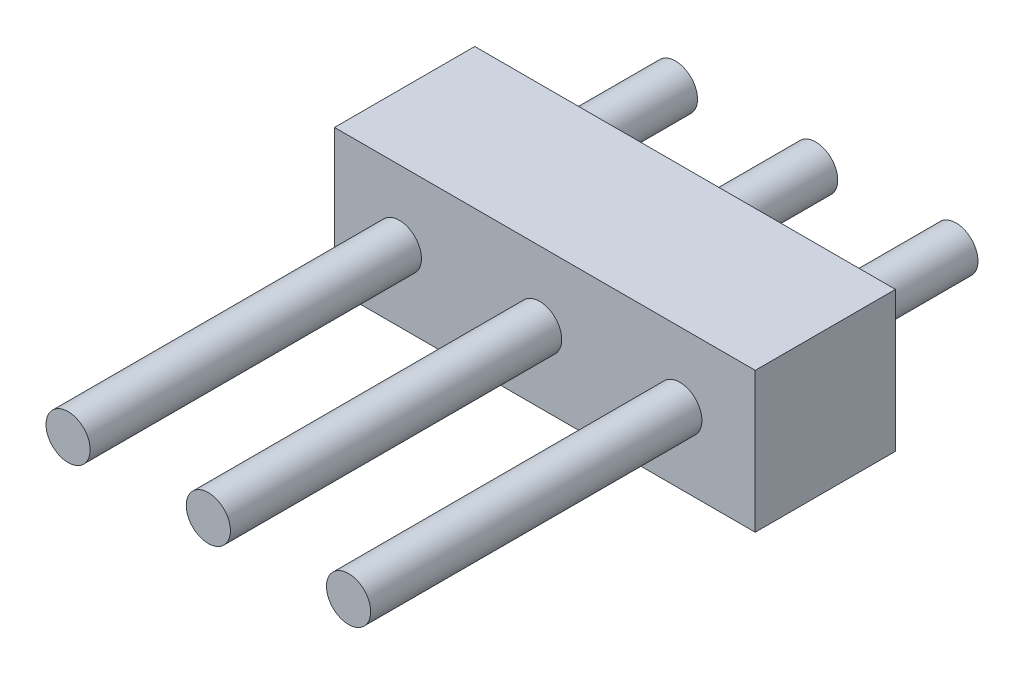
ISO-10303-21;
HEADER;
FILE_DESCRIPTION(('STEP AP214'),'2;1');
FILE_NAME('part.step','',(''),(''),'','','');
FILE_SCHEMA(('AUTOMOTIVE_DESIGN { 1 0 10303 214 1 1 1 1 }'));
ENDSEC;
DATA;
#1=APPLICATION_CONTEXT('core data for automotive mechanical design processes');
#2=APPLICATION_PROTOCOL_DEFINITION('international standard','automotive_design',2000,#1);
#3=PRODUCT_CONTEXT('',#1,'mechanical');
#4=PRODUCT('Part','Part','',(#3));
#5=PRODUCT_RELATED_PRODUCT_CATEGORY('part','',(#4));
#6=PRODUCT_DEFINITION_FORMATION('','',#4);
#7=PRODUCT_DEFINITION_CONTEXT('part definition',#1,'design');
#8=PRODUCT_DEFINITION('design','',#6,#7);
#9=PRODUCT_DEFINITION_SHAPE('','',#8);
#10=(LENGTH_UNIT() NAMED_UNIT(*) SI_UNIT(.MILLI.,.METRE.));
#11=(NAMED_UNIT(*) PLANE_ANGLE_UNIT() SI_UNIT($,.RADIAN.));
#12=(NAMED_UNIT(*) SI_UNIT($,.STERADIAN.) SOLID_ANGLE_UNIT());
#13=UNCERTAINTY_MEASURE_WITH_UNIT(LENGTH_MEASURE(1.E-05),#10,'distance_accuracy_value','');
#14=(GEOMETRIC_REPRESENTATION_CONTEXT(3) GLOBAL_UNCERTAINTY_ASSIGNED_CONTEXT((#13)) GLOBAL_UNIT_ASSIGNED_CONTEXT((#10,
#11,#12)) REPRESENTATION_CONTEXT('',''));
#15=CARTESIAN_POINT('',(0.,0.,0.));
#16=DIRECTION('',(0.,0.,1.));
#17=DIRECTION('',(1.,0.,0.));
#18=AXIS2_PLACEMENT_3D('',#15,#16,#17);
#19=CARTESIAN_POINT('',(0.,2.54,2.54));
#20=DIRECTION('',(0.,0.,-1.));
#21=DIRECTION('',(-1.,0.,0.));
#22=AXIS2_PLACEMENT_3D('',#19,#20,#21);
#23=PLANE('',#22);
#24=CARTESIAN_POINT('',(3.71440860215054,1.27,2.54));
#25=DIRECTION('',(0.,0.,-1.));
#26=DIRECTION('',(-1.,0.,0.));
#27=AXIS2_PLACEMENT_3D('',#24,#25,#26);
#28=CIRCLE('',#27,0.4);
#29=CARTESIAN_POINT('',(3.31440860215054,1.27,2.54));
#30=VERTEX_POINT('',#29);
#31=EDGE_CURVE('E38',#30,#30,#28,.F.);
#32=ORIENTED_EDGE('',*,*,#31,.F.);
#33=EDGE_LOOP('',(#32));
#34=FACE_BOUND('',#33,.T.);
#35=DIRECTION('',(0.,-1.,0.));
#36=VECTOR('',#35,1.);
#37=CARTESIAN_POINT('',(0.,0.,2.54));
#38=LINE('',#37,#36);
#39=CARTESIAN_POINT('',(0.,2.54,2.54));
#40=VERTEX_POINT('',#39);
#41=CARTESIAN_POINT('',(0.,0.,2.54));
#42=VERTEX_POINT('',#41);
#43=EDGE_CURVE('E106',#40,#42,#38,.T.);
#44=ORIENTED_EDGE('',*,*,#43,.T.);
#45=DIRECTION('',(1.,0.,0.));
#46=VECTOR('',#45,1.);
#47=CARTESIAN_POINT('',(0.,0.,2.54));
#48=LINE('',#47,#46);
#49=CARTESIAN_POINT('',(7.62,0.,2.54));
#50=VERTEX_POINT('',#49);
#51=EDGE_CURVE('E87',#42,#50,#48,.T.);
#52=ORIENTED_EDGE('',*,*,#51,.T.);
#53=DIRECTION('',(0.,1.,0.));
#54=VECTOR('',#53,1.);
#55=CARTESIAN_POINT('',(7.62,0.,2.54));
#56=LINE('',#55,#54);
#57=CARTESIAN_POINT('',(7.62,2.54,2.54));
#58=VERTEX_POINT('',#57);
#59=EDGE_CURVE('E51',#50,#58,#56,.T.);
#60=ORIENTED_EDGE('',*,*,#59,.T.);
#61=DIRECTION('',(-1.,0.,0.));
#62=VECTOR('',#61,1.);
#63=CARTESIAN_POINT('',(0.,2.54,2.54));
#64=LINE('',#63,#62);
#65=EDGE_CURVE('E46',#58,#40,#64,.T.);
#66=ORIENTED_EDGE('',*,*,#65,.T.);
#67=EDGE_LOOP('',(#44,#52,#60,#66));
#68=FACE_BOUND('',#67,.T.);
#69=CARTESIAN_POINT('',(1.17440860215054,1.27,2.54));
#70=DIRECTION('',(0.,0.,-1.));
#71=DIRECTION('',(-1.,0.,0.));
#72=AXIS2_PLACEMENT_3D('',#69,#70,#71);
#73=CIRCLE('',#72,0.4);
#74=CARTESIAN_POINT('',(0.774408602150538,1.27,2.54));
#75=VERTEX_POINT('',#74);
#76=EDGE_CURVE('E90',#75,#75,#73,.F.);
#77=ORIENTED_EDGE('',*,*,#76,.F.);
#78=EDGE_LOOP('',(#77));
#79=FACE_BOUND('',#78,.T.);
#80=CARTESIAN_POINT('',(6.25440860215054,1.27,2.54));
#81=DIRECTION('',(0.,0.,-1.));
#82=DIRECTION('',(-1.,0.,0.));
#83=AXIS2_PLACEMENT_3D('',#80,#81,#82);
#84=CIRCLE('',#83,0.4);
#85=CARTESIAN_POINT('',(5.85440860215054,1.27,2.54));
#86=VERTEX_POINT('',#85);
#87=EDGE_CURVE('E11',#86,#86,#84,.F.);
#88=ORIENTED_EDGE('',*,*,#87,.F.);
#89=EDGE_LOOP('',(#88));
#90=FACE_BOUND('',#89,.T.);
#91=ADVANCED_FACE('F29',(#34,#68,#79,#90),#23,.F.);
#92=CARTESIAN_POINT('',(0.,2.54,0.));
#93=DIRECTION('',(0.,0.,-1.));
#94=DIRECTION('',(-1.,0.,0.));
#95=AXIS2_PLACEMENT_3D('',#92,#93,#94);
#96=PLANE('',#95);
#97=CARTESIAN_POINT('',(3.71440860215054,1.27,0.));
#98=DIRECTION('',(0.,0.,-1.));
#99=DIRECTION('',(-1.,0.,0.));
#100=AXIS2_PLACEMENT_3D('',#97,#98,#99);
#101=CIRCLE('',#100,0.4);
#102=CARTESIAN_POINT('',(3.31440860215054,1.27,0.));
#103=VERTEX_POINT('',#102);
#104=EDGE_CURVE('E115',#103,#103,#101,.F.);
#105=ORIENTED_EDGE('',*,*,#104,.T.);
#106=EDGE_LOOP('',(#105));
#107=FACE_BOUND('',#106,.T.);
#108=DIRECTION('',(0.,-1.,0.));
#109=VECTOR('',#108,1.);
#110=CARTESIAN_POINT('',(0.,0.,0.));
#111=LINE('',#110,#109);
#112=CARTESIAN_POINT('',(0.,2.54,0.));
#113=VERTEX_POINT('',#112);
#114=CARTESIAN_POINT('',(0.,0.,0.));
#115=VERTEX_POINT('',#114);
#116=EDGE_CURVE('E78',#113,#115,#111,.T.);
#117=ORIENTED_EDGE('',*,*,#116,.F.);
#118=DIRECTION('',(-1.,0.,0.));
#119=VECTOR('',#118,1.);
#120=CARTESIAN_POINT('',(0.,2.54,0.));
#121=LINE('',#120,#119);
#122=CARTESIAN_POINT('',(7.62,2.54,0.));
#123=VERTEX_POINT('',#122);
#124=EDGE_CURVE('E104',#123,#113,#121,.T.);
#125=ORIENTED_EDGE('',*,*,#124,.F.);
#126=DIRECTION('',(0.,1.,0.));
#127=VECTOR('',#126,1.);
#128=CARTESIAN_POINT('',(7.62,0.,0.));
#129=LINE('',#128,#127);
#130=CARTESIAN_POINT('',(7.62,0.,0.));
#131=VERTEX_POINT('',#130);
#132=EDGE_CURVE('E79',#131,#123,#129,.T.);
#133=ORIENTED_EDGE('',*,*,#132,.F.);
#134=DIRECTION('',(1.,0.,0.));
#135=VECTOR('',#134,1.);
#136=CARTESIAN_POINT('',(0.,0.,0.));
#137=LINE('',#136,#135);
#138=EDGE_CURVE('E72',#115,#131,#137,.T.);
#139=ORIENTED_EDGE('',*,*,#138,.F.);
#140=EDGE_LOOP('',(#117,#125,#133,#139));
#141=FACE_BOUND('',#140,.T.);
#142=CARTESIAN_POINT('',(1.17440860215054,1.27,0.));
#143=DIRECTION('',(0.,0.,-1.));
#144=DIRECTION('',(-1.,0.,0.));
#145=AXIS2_PLACEMENT_3D('',#142,#143,#144);
#146=CIRCLE('',#145,0.4);
#147=CARTESIAN_POINT('',(0.774408602150538,1.27,0.));
#148=VERTEX_POINT('',#147);
#149=EDGE_CURVE('E95',#148,#148,#146,.F.);
#150=ORIENTED_EDGE('',*,*,#149,.T.);
#151=EDGE_LOOP('',(#150));
#152=FACE_BOUND('',#151,.T.);
#153=CARTESIAN_POINT('',(6.25440860215054,1.27,0.));
#154=DIRECTION('',(0.,0.,-1.));
#155=DIRECTION('',(-1.,0.,0.));
#156=AXIS2_PLACEMENT_3D('',#153,#154,#155);
#157=CIRCLE('',#156,0.4);
#158=CARTESIAN_POINT('',(5.85440860215054,1.27,0.));
#159=VERTEX_POINT('',#158);
#160=EDGE_CURVE('E33',#159,#159,#157,.F.);
#161=ORIENTED_EDGE('',*,*,#160,.T.);
#162=EDGE_LOOP('',(#161));
#163=FACE_BOUND('',#162,.T.);
#164=ADVANCED_FACE('F74',(#107,#141,#152,#163),#96,.T.);
#165=CARTESIAN_POINT('',(0.,0.,2.54));
#166=DIRECTION('',(1.,0.,0.));
#167=DIRECTION('',(0.,0.,-1.));
#168=AXIS2_PLACEMENT_3D('',#165,#166,#167);
#169=PLANE('',#168);
#170=ORIENTED_EDGE('',*,*,#116,.T.);
#171=DIRECTION('',(0.,0.,-1.));
#172=VECTOR('',#171,1.);
#173=CARTESIAN_POINT('',(0.,0.,2.54));
#174=LINE('',#173,#172);
#175=EDGE_CURVE('E85',#42,#115,#174,.T.);
#176=ORIENTED_EDGE('',*,*,#175,.F.);
#177=ORIENTED_EDGE('',*,*,#43,.F.);
#178=DIRECTION('',(0.,0.,-1.));
#179=VECTOR('',#178,1.);
#180=CARTESIAN_POINT('',(0.,2.54,2.54));
#181=LINE('',#180,#179);
#182=EDGE_CURVE('E94',#40,#113,#181,.T.);
#183=ORIENTED_EDGE('',*,*,#182,.T.);
#184=EDGE_LOOP('',(#170,#176,#177,#183));
#185=FACE_BOUND('',#184,.T.);
#186=ADVANCED_FACE('F31',(#185),#169,.F.);
#187=CARTESIAN_POINT('',(0.,0.,2.54));
#188=DIRECTION('',(0.,1.,0.));
#189=DIRECTION('',(0.,0.,1.));
#190=AXIS2_PLACEMENT_3D('',#187,#188,#189);
#191=PLANE('',#190);
#192=ORIENTED_EDGE('',*,*,#138,.T.);
#193=DIRECTION('',(0.,0.,-1.));
#194=VECTOR('',#193,1.);
#195=CARTESIAN_POINT('',(7.62,0.,2.54));
#196=LINE('',#195,#194);
#197=EDGE_CURVE('E91',#50,#131,#196,.T.);
#198=ORIENTED_EDGE('',*,*,#197,.F.);
#199=ORIENTED_EDGE('',*,*,#51,.F.);
#200=ORIENTED_EDGE('',*,*,#175,.T.);
#201=EDGE_LOOP('',(#192,#198,#199,#200));
#202=FACE_BOUND('',#201,.T.);
#203=ADVANCED_FACE('F86',(#202),#191,.F.);
#204=CARTESIAN_POINT('',(7.62,0.,2.54));
#205=DIRECTION('',(-1.,0.,0.));
#206=DIRECTION('',(0.,0.,1.));
#207=AXIS2_PLACEMENT_3D('',#204,#205,#206);
#208=PLANE('',#207);
#209=ORIENTED_EDGE('',*,*,#132,.T.);
#210=DIRECTION('',(0.,0.,-1.));
#211=VECTOR('',#210,1.);
#212=CARTESIAN_POINT('',(7.62,2.54,2.54));
#213=LINE('',#212,#211);
#214=EDGE_CURVE('E112',#58,#123,#213,.T.);
#215=ORIENTED_EDGE('',*,*,#214,.F.);
#216=ORIENTED_EDGE('',*,*,#59,.F.);
#217=ORIENTED_EDGE('',*,*,#197,.T.);
#218=EDGE_LOOP('',(#209,#215,#216,#217));
#219=FACE_BOUND('',#218,.T.);
#220=ADVANCED_FACE('F193',(#219),#208,.F.);
#221=CARTESIAN_POINT('',(0.,2.54,2.54));
#222=DIRECTION('',(0.,-1.,0.));
#223=DIRECTION('',(0.,0.,-1.));
#224=AXIS2_PLACEMENT_3D('',#221,#222,#223);
#225=PLANE('',#224);
#226=ORIENTED_EDGE('',*,*,#124,.T.);
#227=ORIENTED_EDGE('',*,*,#182,.F.);
#228=ORIENTED_EDGE('',*,*,#65,.F.);
#229=ORIENTED_EDGE('',*,*,#214,.T.);
#230=EDGE_LOOP('',(#226,#227,#228,#229));
#231=FACE_BOUND('',#230,.T.);
#232=ADVANCED_FACE('F183',(#231),#225,.F.);
#233=CARTESIAN_POINT('',(1.17440860215054,1.27,-2.46));
#234=DIRECTION('',(0.,0.,1.));
#235=DIRECTION('',(1.,0.,0.));
#236=AXIS2_PLACEMENT_3D('',#233,#234,#235);
#237=PLANE('',#236);
#238=CARTESIAN_POINT('',(1.17440860215054,1.27,-2.46));
#239=DIRECTION('',(0.,0.,1.));
#240=DIRECTION('',(1.,0.,0.));
#241=AXIS2_PLACEMENT_3D('',#238,#239,#240);
#242=CIRCLE('',#241,0.4);
#243=CARTESIAN_POINT('',(1.57440860215054,1.27,-2.46));
#244=VERTEX_POINT('',#243);
#245=EDGE_CURVE('E117',#244,#244,#242,.T.);
#246=ORIENTED_EDGE('',*,*,#245,.F.);
#247=EDGE_LOOP('',(#246));
#248=FACE_BOUND('',#247,.T.);
#249=ADVANCED_FACE('F180',(#248),#237,.F.);
#250=CARTESIAN_POINT('',(1.17440860215054,1.27,8.54));
#251=DIRECTION('',(0.,0.,-1.));
#252=DIRECTION('',(-1.,0.,0.));
#253=AXIS2_PLACEMENT_3D('',#250,#251,#252);
#254=CYLINDRICAL_SURFACE('',#253,0.4);
#255=ORIENTED_EDGE('',*,*,#149,.F.);
#256=EDGE_LOOP('',(#255));
#257=FACE_BOUND('',#256,.T.);
#258=ORIENTED_EDGE('',*,*,#245,.T.);
#259=EDGE_LOOP('',(#258));
#260=FACE_BOUND('',#259,.T.);
#261=ADVANCED_FACE('F140',(#257,#260),#254,.T.);
#262=CARTESIAN_POINT('',(1.17440860215054,1.27,8.54));
#263=DIRECTION('',(0.,0.,1.));
#264=DIRECTION('',(1.,0.,0.));
#265=AXIS2_PLACEMENT_3D('',#262,#263,#264);
#266=CIRCLE('',#265,0.4);
#267=CARTESIAN_POINT('',(1.57440860215054,1.27,8.54));
#268=VERTEX_POINT('',#267);
#269=EDGE_CURVE('E98',#268,#268,#266,.T.);
#270=ORIENTED_EDGE('',*,*,#269,.F.);
#271=EDGE_LOOP('',(#270));
#272=FACE_BOUND('',#271,.T.);
#273=ORIENTED_EDGE('',*,*,#76,.T.);
#274=EDGE_LOOP('',(#273));
#275=FACE_BOUND('',#274,.T.);
#276=ADVANCED_FACE('F137',(#272,#275),#254,.T.);
#277=CARTESIAN_POINT('',(1.17440860215054,1.27,8.54));
#278=DIRECTION('',(0.,0.,1.));
#279=DIRECTION('',(1.,0.,0.));
#280=AXIS2_PLACEMENT_3D('',#277,#278,#279);
#281=PLANE('',#280);
#282=ORIENTED_EDGE('',*,*,#269,.T.);
#283=EDGE_LOOP('',(#282));
#284=FACE_BOUND('',#283,.T.);
#285=ADVANCED_FACE('F135',(#284),#281,.T.);
#286=CARTESIAN_POINT('',(3.71440860215054,1.27,-2.46));
#287=DIRECTION('',(0.,0.,1.));
#288=DIRECTION('',(1.,0.,0.));
#289=AXIS2_PLACEMENT_3D('',#286,#287,#288);
#290=PLANE('',#289);
#291=CARTESIAN_POINT('',(3.71440860215054,1.27,-2.46));
#292=DIRECTION('',(0.,0.,1.));
#293=DIRECTION('',(1.,0.,0.));
#294=AXIS2_PLACEMENT_3D('',#291,#292,#293);
#295=CIRCLE('',#294,0.4);
#296=CARTESIAN_POINT('',(4.11440860215054,1.27,-2.46));
#297=VERTEX_POINT('',#296);
#298=EDGE_CURVE('E124',#297,#297,#295,.T.);
#299=ORIENTED_EDGE('',*,*,#298,.F.);
#300=EDGE_LOOP('',(#299));
#301=FACE_BOUND('',#300,.T.);
#302=ADVANCED_FACE('F168',(#301),#290,.F.);
#303=CARTESIAN_POINT('',(3.71440860215054,1.27,8.54));
#304=DIRECTION('',(0.,0.,-1.));
#305=DIRECTION('',(-1.,0.,0.));
#306=AXIS2_PLACEMENT_3D('',#303,#304,#305);
#307=CYLINDRICAL_SURFACE('',#306,0.4);
#308=ORIENTED_EDGE('',*,*,#104,.F.);
#309=EDGE_LOOP('',(#308));
#310=FACE_BOUND('',#309,.T.);
#311=ORIENTED_EDGE('',*,*,#298,.T.);
#312=EDGE_LOOP('',(#311));
#313=FACE_BOUND('',#312,.T.);
#314=ADVANCED_FACE('F171',(#310,#313),#307,.T.);
#315=CARTESIAN_POINT('',(3.71440860215054,1.27,8.54));
#316=DIRECTION('',(0.,0.,1.));
#317=DIRECTION('',(1.,0.,0.));
#318=AXIS2_PLACEMENT_3D('',#315,#316,#317);
#319=CIRCLE('',#318,0.4);
#320=CARTESIAN_POINT('',(4.11440860215054,1.27,8.54));
#321=VERTEX_POINT('',#320);
#322=EDGE_CURVE('E118',#321,#321,#319,.T.);
#323=ORIENTED_EDGE('',*,*,#322,.F.);
#324=EDGE_LOOP('',(#323));
#325=FACE_BOUND('',#324,.T.);
#326=ORIENTED_EDGE('',*,*,#31,.T.);
#327=EDGE_LOOP('',(#326));
#328=FACE_BOUND('',#327,.T.);
#329=ADVANCED_FACE('F176',(#325,#328),#307,.T.);
#330=CARTESIAN_POINT('',(3.71440860215054,1.27,8.54));
#331=DIRECTION('',(0.,0.,1.));
#332=DIRECTION('',(1.,0.,0.));
#333=AXIS2_PLACEMENT_3D('',#330,#331,#332);
#334=PLANE('',#333);
#335=ORIENTED_EDGE('',*,*,#322,.T.);
#336=EDGE_LOOP('',(#335));
#337=FACE_BOUND('',#336,.T.);
#338=ADVANCED_FACE('F173',(#337),#334,.T.);
#339=CARTESIAN_POINT('',(6.25440860215054,1.27,-2.46));
#340=DIRECTION('',(0.,0.,1.));
#341=DIRECTION('',(1.,0.,0.));
#342=AXIS2_PLACEMENT_3D('',#339,#340,#341);
#343=PLANE('',#342);
#344=CARTESIAN_POINT('',(6.25440860215054,1.27,-2.46));
#345=DIRECTION('',(0.,0.,1.));
#346=DIRECTION('',(1.,0.,0.));
#347=AXIS2_PLACEMENT_3D('',#344,#345,#346);
#348=CIRCLE('',#347,0.4);
#349=CARTESIAN_POINT('',(6.65440860215054,1.27,-2.46));
#350=VERTEX_POINT('',#349);
#351=EDGE_CURVE('E309',#350,#350,#348,.T.);
#352=ORIENTED_EDGE('',*,*,#351,.F.);
#353=EDGE_LOOP('',(#352));
#354=FACE_BOUND('',#353,.T.);
#355=ADVANCED_FACE('F163',(#354),#343,.F.);
#356=CARTESIAN_POINT('',(6.25440860215054,1.27,8.54));
#357=DIRECTION('',(0.,0.,-1.));
#358=DIRECTION('',(-1.,0.,0.));
#359=AXIS2_PLACEMENT_3D('',#356,#357,#358);
#360=CYLINDRICAL_SURFACE('',#359,0.4);
#361=ORIENTED_EDGE('',*,*,#160,.F.);
#362=EDGE_LOOP('',(#361));
#363=FACE_BOUND('',#362,.T.);
#364=ORIENTED_EDGE('',*,*,#351,.T.);
#365=EDGE_LOOP('',(#364));
#366=FACE_BOUND('',#365,.T.);
#367=ADVANCED_FACE('F154',(#363,#366),#360,.T.);
#368=CARTESIAN_POINT('',(6.25440860215054,1.27,8.54));
#369=DIRECTION('',(0.,0.,1.));
#370=DIRECTION('',(1.,0.,0.));
#371=AXIS2_PLACEMENT_3D('',#368,#369,#370);
#372=CIRCLE('',#371,0.4);
#373=CARTESIAN_POINT('',(6.65440860215054,1.27,8.54));
#374=VERTEX_POINT('',#373);
#375=EDGE_CURVE('E311',#374,#374,#372,.T.);
#376=ORIENTED_EDGE('',*,*,#375,.F.);
#377=EDGE_LOOP('',(#376));
#378=FACE_BOUND('',#377,.T.);
#379=ORIENTED_EDGE('',*,*,#87,.T.);
#380=EDGE_LOOP('',(#379));
#381=FACE_BOUND('',#380,.T.);
#382=ADVANCED_FACE('F151',(#378,#381),#360,.T.);
#383=CARTESIAN_POINT('',(6.25440860215054,1.27,8.54));
#384=DIRECTION('',(0.,0.,1.));
#385=DIRECTION('',(1.,0.,0.));
#386=AXIS2_PLACEMENT_3D('',#383,#384,#385);
#387=PLANE('',#386);
#388=ORIENTED_EDGE('',*,*,#375,.T.);
#389=EDGE_LOOP('',(#388));
#390=FACE_BOUND('',#389,.T.);
#391=ADVANCED_FACE('F153',(#390),#387,.T.);
#392=CLOSED_SHELL('',(#91,#164,#186,#203,#220,#232,#249,#261,#276,#285,#302,#314,#329,#338,#355,
#367,#382,#391));
#393=MANIFOLD_SOLID_BREP('B2',#392);
#394=ADVANCED_BREP_SHAPE_REPRESENTATION('',(#18,#393),#14);
#395=SHAPE_DEFINITION_REPRESENTATION(#9,#394);
ENDSEC;
END-ISO-10303-21;
